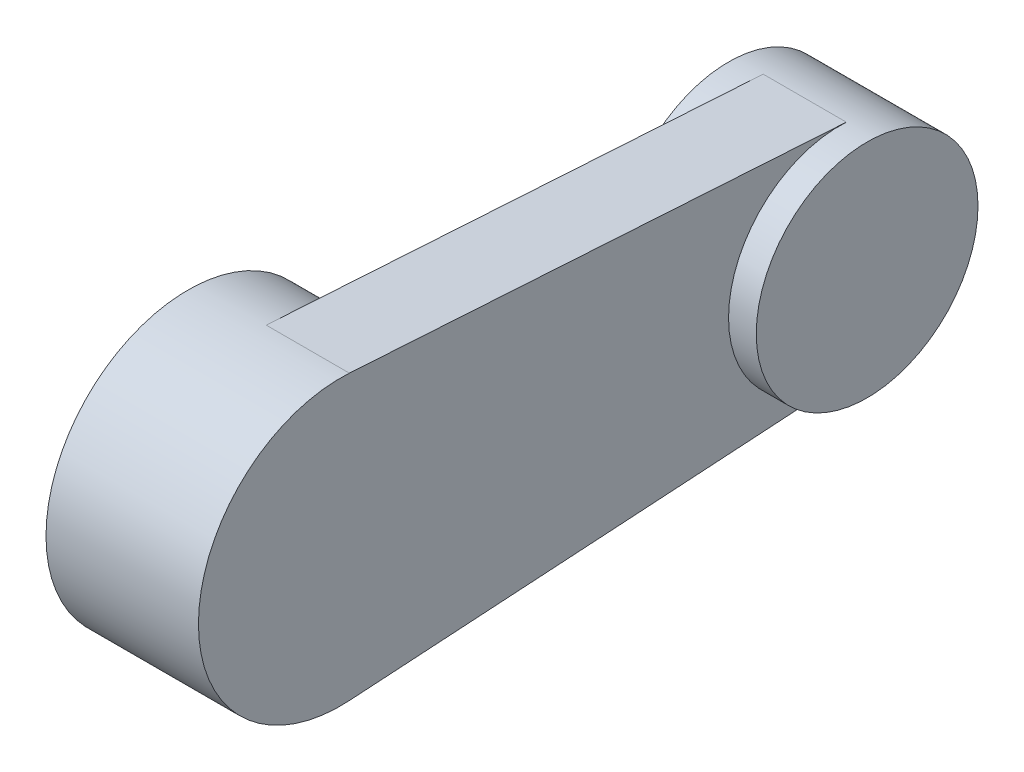
ISO-10303-21;
HEADER;
FILE_DESCRIPTION(('STEP AP214'),'2;1');
FILE_NAME('part.step','',(''),(''),'','','');
FILE_SCHEMA(('AUTOMOTIVE_DESIGN { 1 0 10303 214 1 1 1 1 }'));
ENDSEC;
DATA;
#1=APPLICATION_CONTEXT('core data for automotive mechanical design processes');
#2=APPLICATION_PROTOCOL_DEFINITION('international standard','automotive_design',2000,#1);
#3=PRODUCT_CONTEXT('',#1,'mechanical');
#4=PRODUCT('Part','Part','',(#3));
#5=PRODUCT_RELATED_PRODUCT_CATEGORY('part','',(#4));
#6=PRODUCT_DEFINITION_FORMATION('','',#4);
#7=PRODUCT_DEFINITION_CONTEXT('part definition',#1,'design');
#8=PRODUCT_DEFINITION('design','',#6,#7);
#9=PRODUCT_DEFINITION_SHAPE('','',#8);
#10=(LENGTH_UNIT() NAMED_UNIT(*) SI_UNIT(.MILLI.,.METRE.));
#11=(NAMED_UNIT(*) PLANE_ANGLE_UNIT() SI_UNIT($,.RADIAN.));
#12=(NAMED_UNIT(*) SI_UNIT($,.STERADIAN.) SOLID_ANGLE_UNIT());
#13=UNCERTAINTY_MEASURE_WITH_UNIT(LENGTH_MEASURE(1.E-05),#10,'distance_accuracy_value','');
#14=(GEOMETRIC_REPRESENTATION_CONTEXT(3) GLOBAL_UNCERTAINTY_ASSIGNED_CONTEXT((#13)) GLOBAL_UNIT_ASSIGNED_CONTEXT((#10,
#11,#12)) REPRESENTATION_CONTEXT('',''));
#15=CARTESIAN_POINT('',(0.,0.,0.));
#16=DIRECTION('',(0.,0.,1.));
#17=DIRECTION('',(1.,0.,0.));
#18=AXIS2_PLACEMENT_3D('',#15,#16,#17);
#19=CARTESIAN_POINT('',(0.,0.,-360.));
#20=DIRECTION('',(1.,0.,0.));
#21=DIRECTION('',(0.,0.,-1.));
#22=AXIS2_PLACEMENT_3D('',#19,#20,#21);
#23=PLANE('',#22);
#24=DIRECTION('',(0.,0.0624999999999999,0.998044963916957));
#25=VECTOR('',#24,1.);
#26=CARTESIAN_POINT('',(0.,102.299608801488,-6.40624999999999));
#27=LINE('',#26,#25);
#28=CARTESIAN_POINT('',(0.,79.8435971133566,-365.));
#29=VERTEX_POINT('',#28);
#30=CARTESIAN_POINT('',(0.,102.299608801488,-6.40624999999999));
#31=VERTEX_POINT('',#30);
#32=EDGE_CURVE('E95',#29,#31,#27,.T.);
#33=ORIENTED_EDGE('',*,*,#32,.F.);
#34=CARTESIAN_POINT('',(0.,0.,-360.));
#35=DIRECTION('',(1.,0.,0.));
#36=DIRECTION('',(0.,0.,-1.));
#37=AXIS2_PLACEMENT_3D('',#34,#35,#36);
#38=CIRCLE('',#37,80.);
#39=CARTESIAN_POINT('',(0.,-79.8435971133565,-365.));
#40=VERTEX_POINT('',#39);
#41=EDGE_CURVE('E67',#29,#40,#38,.T.);
#42=ORIENTED_EDGE('',*,*,#41,.T.);
#43=DIRECTION('',(0.,0.0624999999999999,-0.998044963916957));
#44=VECTOR('',#43,1.);
#45=CARTESIAN_POINT('',(0.,-102.299608801488,-6.40624999999999));
#46=LINE('',#45,#44);
#47=CARTESIAN_POINT('',(0.,-102.299608801488,-6.40624999999999));
#48=VERTEX_POINT('',#47);
#49=EDGE_CURVE('E90',#48,#40,#46,.T.);
#50=ORIENTED_EDGE('',*,*,#49,.F.);
#51=CARTESIAN_POINT('',(0.,0.,0.));
#52=DIRECTION('',(-1.,0.,0.));
#53=DIRECTION('',(0.,0.,1.));
#54=AXIS2_PLACEMENT_3D('',#51,#52,#53);
#55=CIRCLE('',#54,102.5);
#56=EDGE_CURVE('E75',#31,#48,#55,.T.);
#57=ORIENTED_EDGE('',*,*,#56,.F.);
#58=EDGE_LOOP('',(#33,#42,#50,#57));
#59=FACE_BOUND('',#58,.T.);
#60=ADVANCED_FACE('F38',(#59),#23,.F.);
#61=CARTESIAN_POINT('',(60.,0.,-360.));
#62=DIRECTION('',(-1.,0.,0.));
#63=DIRECTION('',(0.,0.,1.));
#64=AXIS2_PLACEMENT_3D('',#61,#62,#63);
#65=CYLINDRICAL_SURFACE('',#64,80.);
#66=DIRECTION('',(-1.,0.,0.));
#67=VECTOR('',#66,1.);
#68=CARTESIAN_POINT('',(60.,-79.8435971133566,-365.));
#69=LINE('',#68,#67);
#70=CARTESIAN_POINT('',(60.,-79.8435971133566,-365.));
#71=VERTEX_POINT('',#70);
#72=EDGE_CURVE('E103',#71,#40,#69,.T.);
#73=ORIENTED_EDGE('',*,*,#72,.T.);
#74=ORIENTED_EDGE('',*,*,#41,.F.);
#75=DIRECTION('',(-1.,0.,0.));
#76=VECTOR('',#75,1.);
#77=CARTESIAN_POINT('',(60.,79.8435971133566,-365.));
#78=LINE('',#77,#76);
#79=CARTESIAN_POINT('',(60.,79.8435971133565,-365.));
#80=VERTEX_POINT('',#79);
#81=EDGE_CURVE('E47',#80,#29,#78,.T.);
#82=ORIENTED_EDGE('',*,*,#81,.F.);
#83=CARTESIAN_POINT('',(60.,0.,-360.));
#84=DIRECTION('',(1.,0.,0.));
#85=DIRECTION('',(0.,0.,-1.));
#86=AXIS2_PLACEMENT_3D('',#83,#84,#85);
#87=CIRCLE('',#86,80.);
#88=EDGE_CURVE('E12',#80,#71,#87,.T.);
#89=ORIENTED_EDGE('',*,*,#88,.T.);
#90=EDGE_LOOP('',(#73,#74,#82,#89));
#91=FACE_BOUND('',#90,.T.);
#92=CARTESIAN_POINT('',(80.,0.,-360.));
#93=DIRECTION('',(1.,0.,0.));
#94=DIRECTION('',(0.,0.,-1.));
#95=AXIS2_PLACEMENT_3D('',#92,#93,#94);
#96=CIRCLE('',#95,80.);
#97=CARTESIAN_POINT('',(80.,0.,-440.));
#98=VERTEX_POINT('',#97);
#99=EDGE_CURVE('E115',#98,#98,#96,.F.);
#100=ORIENTED_EDGE('',*,*,#99,.T.);
#101=EDGE_LOOP('',(#100));
#102=FACE_BOUND('',#101,.T.);
#103=CARTESIAN_POINT('',(-20.,0.,-360.));
#104=DIRECTION('',(-1.,0.,0.));
#105=DIRECTION('',(0.,0.,1.));
#106=AXIS2_PLACEMENT_3D('',#103,#104,#105);
#107=CIRCLE('',#106,80.);
#108=CARTESIAN_POINT('',(-20.,0.,-280.));
#109=VERTEX_POINT('',#108);
#110=EDGE_CURVE('E118',#109,#109,#107,.T.);
#111=ORIENTED_EDGE('',*,*,#110,.F.);
#112=EDGE_LOOP('',(#111));
#113=FACE_BOUND('',#112,.T.);
#114=ADVANCED_FACE('F40',(#91,#102,#113),#65,.T.);
#115=CARTESIAN_POINT('',(60.,102.299608801488,-6.40624999999999));
#116=DIRECTION('',(0.,-0.998044963916957,0.0624999999999999));
#117=DIRECTION('',(0.,-0.0624999999999999,-0.998044963916957));
#118=AXIS2_PLACEMENT_3D('',#115,#116,#117);
#119=PLANE('',#118);
#120=ORIENTED_EDGE('',*,*,#32,.T.);
#121=DIRECTION('',(-1.,0.,0.));
#122=VECTOR('',#121,1.);
#123=CARTESIAN_POINT('',(60.,102.299608801488,-6.40624999999999));
#124=LINE('',#123,#122);
#125=CARTESIAN_POINT('',(60.,102.299608801488,-6.40624999999999));
#126=VERTEX_POINT('',#125);
#127=EDGE_CURVE('E93',#126,#31,#124,.T.);
#128=ORIENTED_EDGE('',*,*,#127,.F.);
#129=DIRECTION('',(0.,0.0624999999999999,0.998044963916957));
#130=VECTOR('',#129,1.);
#131=CARTESIAN_POINT('',(60.,102.299608801488,-6.40624999999999));
#132=LINE('',#131,#130);
#133=EDGE_CURVE('E82',#80,#126,#132,.T.);
#134=ORIENTED_EDGE('',*,*,#133,.F.);
#135=ORIENTED_EDGE('',*,*,#81,.T.);
#136=EDGE_LOOP('',(#120,#128,#134,#135));
#137=FACE_BOUND('',#136,.T.);
#138=ADVANCED_FACE('F94',(#137),#119,.F.);
#139=CARTESIAN_POINT('',(60.,0.,0.));
#140=DIRECTION('',(-1.,0.,0.));
#141=DIRECTION('',(0.,0.,1.));
#142=AXIS2_PLACEMENT_3D('',#139,#140,#141);
#143=CYLINDRICAL_SURFACE('',#142,102.5);
#144=ORIENTED_EDGE('',*,*,#127,.T.);
#145=ORIENTED_EDGE('',*,*,#56,.T.);
#146=DIRECTION('',(-1.,0.,0.));
#147=VECTOR('',#146,1.);
#148=CARTESIAN_POINT('',(60.,-102.299608801488,-6.40624999999999));
#149=LINE('',#148,#147);
#150=CARTESIAN_POINT('',(60.,-102.299608801488,-6.40624999999999));
#151=VERTEX_POINT('',#150);
#152=EDGE_CURVE('E97',#151,#48,#149,.T.);
#153=ORIENTED_EDGE('',*,*,#152,.F.);
#154=CARTESIAN_POINT('',(60.,0.,0.));
#155=DIRECTION('',(1.,0.,0.));
#156=DIRECTION('',(0.,0.,-1.));
#157=AXIS2_PLACEMENT_3D('',#154,#155,#156);
#158=CIRCLE('',#157,102.5);
#159=EDGE_CURVE('E86',#126,#151,#158,.T.);
#160=ORIENTED_EDGE('',*,*,#159,.F.);
#161=EDGE_LOOP('',(#144,#145,#153,#160));
#162=FACE_BOUND('',#161,.T.);
#163=CARTESIAN_POINT('',(-50.,0.,0.));
#164=DIRECTION('',(-1.,0.,0.));
#165=DIRECTION('',(0.,0.,1.));
#166=AXIS2_PLACEMENT_3D('',#163,#164,#165);
#167=CIRCLE('',#166,102.5);
#168=CARTESIAN_POINT('',(-50.,0.,102.5));
#169=VERTEX_POINT('',#168);
#170=EDGE_CURVE('E108',#169,#169,#167,.T.);
#171=ORIENTED_EDGE('',*,*,#170,.F.);
#172=EDGE_LOOP('',(#171));
#173=FACE_BOUND('',#172,.T.);
#174=ADVANCED_FACE('F99',(#162,#173),#143,.T.);
#175=CARTESIAN_POINT('',(60.,-102.299608801488,-6.40624999999999));
#176=DIRECTION('',(0.,0.998044963916957,0.0624999999999999));
#177=DIRECTION('',(0.,-0.0624999999999999,0.998044963916957));
#178=AXIS2_PLACEMENT_3D('',#175,#176,#177);
#179=PLANE('',#178);
#180=ORIENTED_EDGE('',*,*,#49,.T.);
#181=ORIENTED_EDGE('',*,*,#72,.F.);
#182=DIRECTION('',(0.,0.0624999999999999,-0.998044963916957));
#183=VECTOR('',#182,1.);
#184=CARTESIAN_POINT('',(60.,-102.299608801488,-6.40624999999999));
#185=LINE('',#184,#183);
#186=EDGE_CURVE('E55',#151,#71,#185,.T.);
#187=ORIENTED_EDGE('',*,*,#186,.F.);
#188=ORIENTED_EDGE('',*,*,#152,.T.);
#189=EDGE_LOOP('',(#180,#181,#187,#188));
#190=FACE_BOUND('',#189,.T.);
#191=ADVANCED_FACE('F114',(#190),#179,.F.);
#192=CARTESIAN_POINT('',(60.,0.,-360.));
#193=DIRECTION('',(1.,0.,0.));
#194=DIRECTION('',(0.,0.,-1.));
#195=AXIS2_PLACEMENT_3D('',#192,#193,#194);
#196=PLANE('',#195);
#197=ORIENTED_EDGE('',*,*,#88,.F.);
#198=ORIENTED_EDGE('',*,*,#133,.T.);
#199=ORIENTED_EDGE('',*,*,#159,.T.);
#200=ORIENTED_EDGE('',*,*,#186,.T.);
#201=EDGE_LOOP('',(#197,#198,#199,#200));
#202=FACE_BOUND('',#201,.T.);
#203=ADVANCED_FACE('F84',(#202),#196,.T.);
#204=CARTESIAN_POINT('',(-50.,0.,0.));
#205=DIRECTION('',(-1.,0.,0.));
#206=DIRECTION('',(0.,0.,1.));
#207=AXIS2_PLACEMENT_3D('',#204,#205,#206);
#208=PLANE('',#207);
#209=ORIENTED_EDGE('',*,*,#170,.T.);
#210=EDGE_LOOP('',(#209));
#211=FACE_BOUND('',#210,.T.);
#212=ADVANCED_FACE('F125',(#211),#208,.T.);
#213=CARTESIAN_POINT('',(80.,0.,-360.));
#214=DIRECTION('',(1.,0.,0.));
#215=DIRECTION('',(0.,0.,-1.));
#216=AXIS2_PLACEMENT_3D('',#213,#214,#215);
#217=PLANE('',#216);
#218=ORIENTED_EDGE('',*,*,#99,.F.);
#219=EDGE_LOOP('',(#218));
#220=FACE_BOUND('',#219,.T.);
#221=ADVANCED_FACE('F143',(#220),#217,.T.);
#222=CARTESIAN_POINT('',(-20.,0.,-360.));
#223=DIRECTION('',(-1.,0.,0.));
#224=DIRECTION('',(0.,0.,1.));
#225=AXIS2_PLACEMENT_3D('',#222,#223,#224);
#226=PLANE('',#225);
#227=ORIENTED_EDGE('',*,*,#110,.T.);
#228=EDGE_LOOP('',(#227));
#229=FACE_BOUND('',#228,.T.);
#230=ADVANCED_FACE('F146',(#229),#226,.T.);
#231=CLOSED_SHELL('',(#60,#114,#138,#174,#191,#203,#212,#221,#230));
#232=MANIFOLD_SOLID_BREP('B2',#231);
#233=ADVANCED_BREP_SHAPE_REPRESENTATION('',(#18,#232),#14);
#234=SHAPE_DEFINITION_REPRESENTATION(#9,#233);
ENDSEC;
END-ISO-10303-21;
